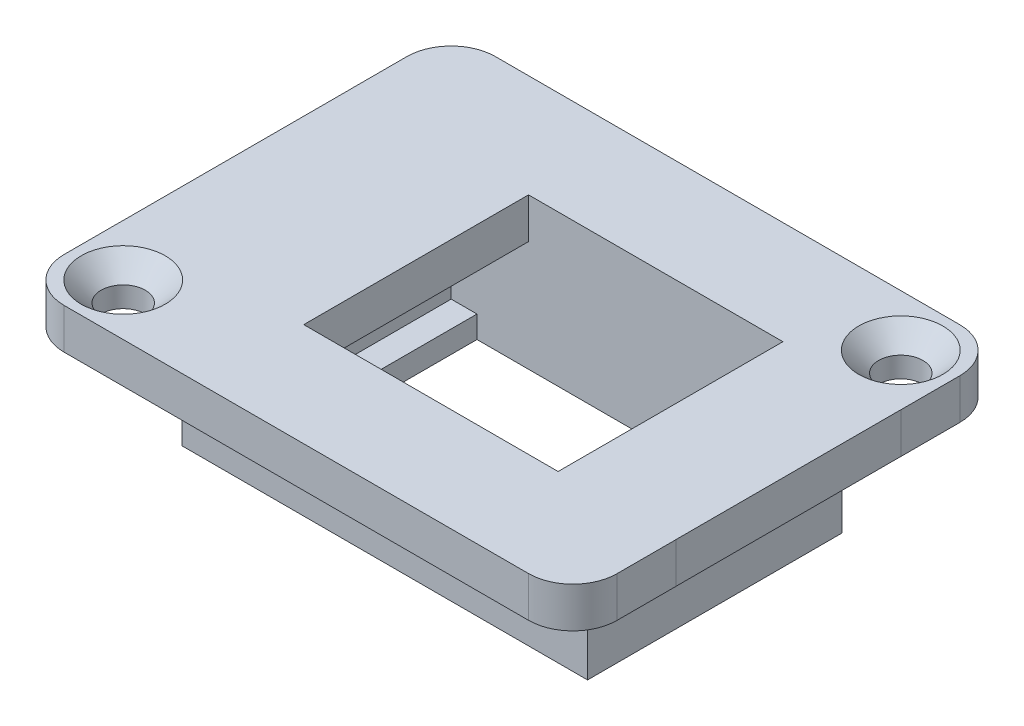
ISO-10303-21;
HEADER;
FILE_DESCRIPTION(('STEP AP214'),'2;1');
FILE_NAME('part.step','',(''),(''),'','','');
FILE_SCHEMA(('AUTOMOTIVE_DESIGN { 1 0 10303 214 1 1 1 1 }'));
ENDSEC;
DATA;
#1=APPLICATION_CONTEXT('core data for automotive mechanical design processes');
#2=APPLICATION_PROTOCOL_DEFINITION('international standard','automotive_design',2000,#1);
#3=PRODUCT_CONTEXT('',#1,'mechanical');
#4=PRODUCT('Part','Part','',(#3));
#5=PRODUCT_RELATED_PRODUCT_CATEGORY('part','',(#4));
#6=PRODUCT_DEFINITION_FORMATION('','',#4);
#7=PRODUCT_DEFINITION_CONTEXT('part definition',#1,'design');
#8=PRODUCT_DEFINITION('design','',#6,#7);
#9=PRODUCT_DEFINITION_SHAPE('','',#8);
#10=(LENGTH_UNIT() NAMED_UNIT(*) SI_UNIT(.MILLI.,.METRE.));
#11=(NAMED_UNIT(*) PLANE_ANGLE_UNIT() SI_UNIT($,.RADIAN.));
#12=(NAMED_UNIT(*) SI_UNIT($,.STERADIAN.) SOLID_ANGLE_UNIT());
#13=UNCERTAINTY_MEASURE_WITH_UNIT(LENGTH_MEASURE(1.E-05),#10,'distance_accuracy_value','');
#14=(GEOMETRIC_REPRESENTATION_CONTEXT(3) GLOBAL_UNCERTAINTY_ASSIGNED_CONTEXT((#13)) GLOBAL_UNIT_ASSIGNED_CONTEXT((#10,
#11,#12)) REPRESENTATION_CONTEXT('',''));
#15=CARTESIAN_POINT('',(0.,0.,0.));
#16=DIRECTION('',(0.,0.,1.));
#17=DIRECTION('',(1.,0.,0.));
#18=AXIS2_PLACEMENT_3D('',#15,#16,#17);
#19=CARTESIAN_POINT('',(10.753383916656,-1.9966045543594,15.25));
#20=DIRECTION('',(0.,1.,0.));
#21=DIRECTION('',(0.,0.,1.));
#22=AXIS2_PLACEMENT_3D('',#19,#20,#21);
#23=PLANE('',#22);
#24=DIRECTION('',(0.,0.,-1.));
#25=VECTOR('',#24,1.);
#26=CARTESIAN_POINT('',(-11.7499999999997,-1.99660455435946,15.25));
#27=LINE('',#26,#25);
#28=CARTESIAN_POINT('',(-11.7499999999997,-1.9966045543594,15.25));
#29=VERTEX_POINT('',#28);
#30=CARTESIAN_POINT('',(-11.7499999999997,-1.9966045543594,0.));
#31=VERTEX_POINT('',#30);
#32=EDGE_CURVE('E409',#29,#31,#27,.T.);
#33=ORIENTED_EDGE('',*,*,#32,.T.);
#34=DIRECTION('',(1.,0.,0.));
#35=VECTOR('',#34,1.);
#36=CARTESIAN_POINT('',(-13.7500000000001,-1.9966045543594,0.));
#37=LINE('',#36,#35);
#38=CARTESIAN_POINT('',(-6.50338391665595,-1.9966045543594,0.));
#39=VERTEX_POINT('',#38);
#40=EDGE_CURVE('E299',#31,#39,#37,.T.);
#41=ORIENTED_EDGE('',*,*,#40,.T.);
#42=DIRECTION('',(0.,0.,-1.));
#43=VECTOR('',#42,1.);
#44=CARTESIAN_POINT('',(-6.50338391665595,-1.9966045543594,15.25));
#45=LINE('',#44,#43);
#46=CARTESIAN_POINT('',(-6.50338391665595,-1.9966045543594,15.25));
#47=VERTEX_POINT('',#46);
#48=EDGE_CURVE('E406',#47,#39,#45,.T.);
#49=ORIENTED_EDGE('',*,*,#48,.F.);
#50=DIRECTION('',(1.,0.,0.));
#51=VECTOR('',#50,1.);
#52=CARTESIAN_POINT('',(-13.7500000000001,-1.9966045543594,15.25));
#53=LINE('',#52,#51);
#54=EDGE_CURVE('E290',#29,#47,#53,.T.);
#55=ORIENTED_EDGE('',*,*,#54,.F.);
#56=EDGE_LOOP('',(#33,#41,#49,#55));
#57=FACE_BOUND('',#56,.T.);
#58=ADVANCED_FACE('F42',(#57),#23,.F.);
#59=CARTESIAN_POINT('',(-15.2500000000001,-1.9966045543594,18.75));
#60=DIRECTION('',(0.,-1.,0.));
#61=DIRECTION('',(0.,0.,-1.));
#62=AXIS2_PLACEMENT_3D('',#59,#60,#61);
#63=CIRCLE('',#62,1.5);
#64=CARTESIAN_POINT('',(-15.2500000000001,-1.9966045543594,17.25));
#65=VERTEX_POINT('',#64);
#66=EDGE_CURVE('E318',#65,#65,#63,.T.);
#67=ORIENTED_EDGE('',*,*,#66,.F.);
#68=EDGE_LOOP('',(#67));
#69=FACE_BOUND('',#68,.T.);
#70=CARTESIAN_POINT('',(15.25,-1.9966045543594,-3.5));
#71=DIRECTION('',(0.,-1.,0.));
#72=DIRECTION('',(0.,0.,-1.));
#73=AXIS2_PLACEMENT_3D('',#70,#71,#72);
#74=CIRCLE('',#73,1.5);
#75=CARTESIAN_POINT('',(15.25,-1.9966045543594,-5.));
#76=VERTEX_POINT('',#75);
#77=EDGE_CURVE('E323',#76,#76,#74,.T.);
#78=ORIENTED_EDGE('',*,*,#77,.F.);
#79=EDGE_LOOP('',(#78));
#80=FACE_BOUND('',#79,.T.);
#81=DIRECTION('',(0.,0.,-1.));
#82=VECTOR('',#81,1.);
#83=CARTESIAN_POINT('',(18.753383916656,-1.9966045543594,22.25));
#84=LINE('',#83,#82);
#85=CARTESIAN_POINT('',(18.753383916656,-1.9966045543594,19.25));
#86=VERTEX_POINT('',#85);
#87=CARTESIAN_POINT('',(18.753383916656,-1.9966045543594,15.25));
#88=VERTEX_POINT('',#87);
#89=EDGE_CURVE('E463',#86,#88,#84,.T.);
#90=ORIENTED_EDGE('',*,*,#89,.F.);
#91=CARTESIAN_POINT('',(15.753383916656,-1.9966045543594,19.25));
#92=DIRECTION('',(0.,1.,0.));
#93=DIRECTION('',(0.,0.,1.));
#94=AXIS2_PLACEMENT_3D('',#91,#92,#93);
#95=CIRCLE('',#94,3.);
#96=CARTESIAN_POINT('',(15.753383916656,-1.9966045543594,22.25));
#97=VERTEX_POINT('',#96);
#98=EDGE_CURVE('E577',#86,#97,#95,.F.);
#99=ORIENTED_EDGE('',*,*,#98,.T.);
#100=DIRECTION('',(1.,0.,0.));
#101=VECTOR('',#100,1.);
#102=CARTESIAN_POINT('',(18.753383916656,-1.9966045543594,22.25));
#103=LINE('',#102,#101);
#104=CARTESIAN_POINT('',(-15.7533839166561,-1.9966045543594,22.25));
#105=VERTEX_POINT('',#104);
#106=EDGE_CURVE('E438',#105,#97,#103,.T.);
#107=ORIENTED_EDGE('',*,*,#106,.F.);
#108=CARTESIAN_POINT('',(-15.7533839166561,-1.9966045543594,19.25));
#109=DIRECTION('',(0.,1.,0.));
#110=DIRECTION('',(0.,0.,1.));
#111=AXIS2_PLACEMENT_3D('',#108,#109,#110);
#112=CIRCLE('',#111,3.);
#113=CARTESIAN_POINT('',(-18.7533839166561,-1.9966045543594,19.25));
#114=VERTEX_POINT('',#113);
#115=EDGE_CURVE('E574',#105,#114,#112,.F.);
#116=ORIENTED_EDGE('',*,*,#115,.T.);
#117=DIRECTION('',(0.,0.,-1.));
#118=VECTOR('',#117,1.);
#119=CARTESIAN_POINT('',(-18.7533839166561,-1.9966045543594,22.25));
#120=LINE('',#119,#118);
#121=CARTESIAN_POINT('',(-18.7533839166561,-1.9966045543594,15.25));
#122=VERTEX_POINT('',#121);
#123=EDGE_CURVE('E466',#114,#122,#120,.T.);
#124=ORIENTED_EDGE('',*,*,#123,.T.);
#125=DIRECTION('',(1.,0.,0.));
#126=VECTOR('',#125,1.);
#127=CARTESIAN_POINT('',(18.753383916656,-1.9966045543594,15.25));
#128=LINE('',#127,#126);
#129=CARTESIAN_POINT('',(-18.7500000000001,-1.9966045543594,15.25));
#130=VERTEX_POINT('',#129);
#131=EDGE_CURVE('E454',#122,#130,#128,.T.);
#132=ORIENTED_EDGE('',*,*,#131,.T.);
#133=DIRECTION('',(0.,0.,-1.));
#134=VECTOR('',#133,1.);
#135=CARTESIAN_POINT('',(-18.7500000000001,-1.9966045543594,15.25));
#136=LINE('',#135,#134);
#137=CARTESIAN_POINT('',(-18.7500000000001,-1.9966045543594,0.));
#138=VERTEX_POINT('',#137);
#139=EDGE_CURVE('E425',#130,#138,#136,.T.);
#140=ORIENTED_EDGE('',*,*,#139,.T.);
#141=DIRECTION('',(-1.,0.,0.));
#142=VECTOR('',#141,1.);
#143=CARTESIAN_POINT('',(-18.7533839166561,-1.9966045543594,0.));
#144=LINE('',#143,#142);
#145=CARTESIAN_POINT('',(-18.7533839166561,-1.9966045543594,0.));
#146=VERTEX_POINT('',#145);
#147=EDGE_CURVE('E346',#138,#146,#144,.T.);
#148=ORIENTED_EDGE('',*,*,#147,.T.);
#149=DIRECTION('',(0.,0.,1.));
#150=VECTOR('',#149,1.);
#151=CARTESIAN_POINT('',(-18.7533839166561,-1.9966045543594,-7.));
#152=LINE('',#151,#150);
#153=CARTESIAN_POINT('',(-18.7533839166561,-1.9966045543594,-4.));
#154=VERTEX_POINT('',#153);
#155=EDGE_CURVE('E356',#154,#146,#152,.T.);
#156=ORIENTED_EDGE('',*,*,#155,.F.);
#157=CARTESIAN_POINT('',(-15.7533839166561,-1.9966045543594,-4.));
#158=DIRECTION('',(0.,1.,0.));
#159=DIRECTION('',(0.,0.,1.));
#160=AXIS2_PLACEMENT_3D('',#157,#158,#159);
#161=CIRCLE('',#160,3.);
#162=CARTESIAN_POINT('',(-15.7533839166561,-1.9966045543594,-7.));
#163=VERTEX_POINT('',#162);
#164=EDGE_CURVE('E571',#154,#163,#161,.F.);
#165=ORIENTED_EDGE('',*,*,#164,.T.);
#166=DIRECTION('',(-1.,0.,0.));
#167=VECTOR('',#166,1.);
#168=CARTESIAN_POINT('',(-18.7533839166561,-1.9966045543594,-7.));
#169=LINE('',#168,#167);
#170=CARTESIAN_POINT('',(15.7533839166559,-1.9966045543594,-7.));
#171=VERTEX_POINT('',#170);
#172=EDGE_CURVE('E331',#171,#163,#169,.T.);
#173=ORIENTED_EDGE('',*,*,#172,.F.);
#174=CARTESIAN_POINT('',(15.753383916656,-1.9966045543594,-4.));
#175=DIRECTION('',(0.,1.,0.));
#176=DIRECTION('',(0.,0.,1.));
#177=AXIS2_PLACEMENT_3D('',#174,#175,#176);
#178=CIRCLE('',#177,3.);
#179=CARTESIAN_POINT('',(18.753383916656,-1.9966045543594,-4.));
#180=VERTEX_POINT('',#179);
#181=EDGE_CURVE('E568',#171,#180,#178,.F.);
#182=ORIENTED_EDGE('',*,*,#181,.T.);
#183=DIRECTION('',(0.,0.,1.));
#184=VECTOR('',#183,1.);
#185=CARTESIAN_POINT('',(18.753383916656,-1.9966045543594,-7.));
#186=LINE('',#185,#184);
#187=CARTESIAN_POINT('',(18.753383916656,-1.9966045543594,0.));
#188=VERTEX_POINT('',#187);
#189=EDGE_CURVE('E359',#180,#188,#186,.T.);
#190=ORIENTED_EDGE('',*,*,#189,.T.);
#191=CARTESIAN_POINT('',(18.75,-1.9966045543594,0.));
#192=VERTEX_POINT('',#191);
#193=EDGE_CURVE('E347',#188,#192,#144,.T.);
#194=ORIENTED_EDGE('',*,*,#193,.T.);
#195=DIRECTION('',(0.,0.,-1.));
#196=VECTOR('',#195,1.);
#197=CARTESIAN_POINT('',(18.75,-1.9966045543594,15.25));
#198=LINE('',#197,#196);
#199=CARTESIAN_POINT('',(18.75,-1.9966045543594,15.25));
#200=VERTEX_POINT('',#199);
#201=EDGE_CURVE('E529',#200,#192,#198,.T.);
#202=ORIENTED_EDGE('',*,*,#201,.F.);
#203=EDGE_CURVE('E453',#200,#88,#128,.T.);
#204=ORIENTED_EDGE('',*,*,#203,.T.);
#205=EDGE_LOOP('',(#90,#99,#107,#116,#124,#132,#140,#148,#156,#165,#173,#182,#190,#194,#202,#204));
#206=FACE_BOUND('',#205,.T.);
#207=DIRECTION('',(1.,0.,0.));
#208=VECTOR('',#207,1.);
#209=CARTESIAN_POINT('',(-13.7500000000001,-1.9966045543594,-1.));
#210=LINE('',#209,#208);
#211=CARTESIAN_POINT('',(-13.7500000000001,-1.9966045543594,-0.999999999999997));
#212=VERTEX_POINT('',#211);
#213=CARTESIAN_POINT('',(13.75,-1.9966045543594,-1.));
#214=VERTEX_POINT('',#213);
#215=EDGE_CURVE('E280',#212,#214,#210,.T.);
#216=ORIENTED_EDGE('',*,*,#215,.F.);
#217=DIRECTION('',(0.,0.,-1.));
#218=VECTOR('',#217,1.);
#219=CARTESIAN_POINT('',(-13.7500000000001,-1.9966045543594,15.25));
#220=LINE('',#219,#218);
#221=CARTESIAN_POINT('',(-13.7500000000001,-1.9966045543594,16.25));
#222=VERTEX_POINT('',#221);
#223=EDGE_CURVE('E60',#222,#212,#220,.T.);
#224=ORIENTED_EDGE('',*,*,#223,.F.);
#225=DIRECTION('',(1.,0.,0.));
#226=VECTOR('',#225,1.);
#227=CARTESIAN_POINT('',(-13.7500000000001,-1.9966045543594,16.25));
#228=LINE('',#227,#226);
#229=CARTESIAN_POINT('',(13.75,-1.9966045543594,16.25));
#230=VERTEX_POINT('',#229);
#231=EDGE_CURVE('E295',#222,#230,#228,.T.);
#232=ORIENTED_EDGE('',*,*,#231,.T.);
#233=DIRECTION('',(0.,0.,-1.));
#234=VECTOR('',#233,1.);
#235=CARTESIAN_POINT('',(13.75,-1.9966045543594,15.25));
#236=LINE('',#235,#234);
#237=EDGE_CURVE('E67',#230,#214,#236,.T.);
#238=ORIENTED_EDGE('',*,*,#237,.T.);
#239=EDGE_LOOP('',(#216,#224,#232,#238));
#240=FACE_BOUND('',#239,.T.);
#241=ADVANCED_FACE('F619',(#69,#80,#206,#240),#23,.F.);
#242=DIRECTION('',(0.,0.,-1.));
#243=VECTOR('',#242,1.);
#244=CARTESIAN_POINT('',(10.753383916656,-1.9966045543594,15.25));
#245=LINE('',#244,#243);
#246=CARTESIAN_POINT('',(10.753383916656,-1.9966045543594,15.25));
#247=VERTEX_POINT('',#246);
#248=CARTESIAN_POINT('',(10.753383916656,-1.9966045543594,0.));
#249=VERTEX_POINT('',#248);
#250=EDGE_CURVE('E517',#247,#249,#245,.T.);
#251=ORIENTED_EDGE('',*,*,#250,.T.);
#252=CARTESIAN_POINT('',(11.75,-1.9966045543594,0.));
#253=VERTEX_POINT('',#252);
#254=EDGE_CURVE('E284',#249,#253,#37,.T.);
#255=ORIENTED_EDGE('',*,*,#254,.T.);
#256=DIRECTION('',(0.,0.,-1.));
#257=VECTOR('',#256,1.);
#258=CARTESIAN_POINT('',(11.75,-1.9966045543594,15.25));
#259=LINE('',#258,#257);
#260=CARTESIAN_POINT('',(11.75,-1.9966045543594,15.25));
#261=VERTEX_POINT('',#260);
#262=EDGE_CURVE('E513',#261,#253,#259,.T.);
#263=ORIENTED_EDGE('',*,*,#262,.F.);
#264=EDGE_CURVE('E298',#247,#261,#53,.T.);
#265=ORIENTED_EDGE('',*,*,#264,.F.);
#266=EDGE_LOOP('',(#251,#255,#263,#265));
#267=FACE_BOUND('',#266,.T.);
#268=ADVANCED_FACE('F622',(#267),#23,.F.);
#269=CARTESIAN_POINT('',(0.,0.,15.25));
#270=DIRECTION('',(0.,0.,-1.));
#271=DIRECTION('',(-1.,0.,0.));
#272=AXIS2_PLACEMENT_3D('',#269,#270,#271);
#273=PLANE('',#272);
#274=DIRECTION('',(-1.,0.,0.));
#275=VECTOR('',#274,1.);
#276=CARTESIAN_POINT('',(-18.7533839166561,0.750000000000002,15.25));
#277=LINE('',#276,#275);
#278=CARTESIAN_POINT('',(-18.7500000000001,0.75,15.25));
#279=VERTEX_POINT('',#278);
#280=CARTESIAN_POINT('',(-18.7533839166561,0.750000000000002,15.25));
#281=VERTEX_POINT('',#280);
#282=EDGE_CURVE('E433',#279,#281,#277,.T.);
#283=ORIENTED_EDGE('',*,*,#282,.F.);
#284=DIRECTION('',(0.,-1.,0.));
#285=VECTOR('',#284,1.);
#286=CARTESIAN_POINT('',(-18.7500000000001,0.75,15.25));
#287=LINE('',#286,#285);
#288=EDGE_CURVE('E366',#279,#130,#287,.T.);
#289=ORIENTED_EDGE('',*,*,#288,.T.);
#290=ORIENTED_EDGE('',*,*,#131,.F.);
#291=DIRECTION('',(0.,-1.,0.));
#292=VECTOR('',#291,1.);
#293=CARTESIAN_POINT('',(-18.7533839166561,-1.9966045543594,15.25));
#294=LINE('',#293,#292);
#295=EDGE_CURVE('E448',#281,#122,#294,.T.);
#296=ORIENTED_EDGE('',*,*,#295,.F.);
#297=EDGE_LOOP('',(#283,#289,#290,#296));
#298=FACE_BOUND('',#297,.T.);
#299=ADVANCED_FACE('F630',(#298),#273,.T.);
#300=DIRECTION('',(0.,-1.,0.));
#301=VECTOR('',#300,1.);
#302=CARTESIAN_POINT('',(10.753383916656,0.75,15.25));
#303=LINE('',#302,#301);
#304=CARTESIAN_POINT('',(10.753383916656,0.75,15.25));
#305=VERTEX_POINT('',#304);
#306=EDGE_CURVE('E486',#305,#247,#303,.T.);
#307=ORIENTED_EDGE('',*,*,#306,.T.);
#308=ORIENTED_EDGE('',*,*,#264,.T.);
#309=DIRECTION('',(0.,-1.,0.));
#310=VECTOR('',#309,1.);
#311=CARTESIAN_POINT('',(11.75,-8.,15.25));
#312=LINE('',#311,#310);
#313=CARTESIAN_POINT('',(11.75,-8.,15.25));
#314=VERTEX_POINT('',#313);
#315=EDGE_CURVE('E490',#261,#314,#312,.T.);
#316=ORIENTED_EDGE('',*,*,#315,.T.);
#317=DIRECTION('',(-1.,0.,0.));
#318=VECTOR('',#317,1.);
#319=CARTESIAN_POINT('',(10.25,-8.,15.25));
#320=LINE('',#319,#318);
#321=CARTESIAN_POINT('',(10.25,-8.,15.25));
#322=VERTEX_POINT('',#321);
#323=EDGE_CURVE('E473',#314,#322,#320,.T.);
#324=ORIENTED_EDGE('',*,*,#323,.T.);
#325=DIRECTION('',(0.,-1.,0.));
#326=VECTOR('',#325,1.);
#327=CARTESIAN_POINT('',(10.25,-8.,15.25));
#328=LINE('',#327,#326);
#329=CARTESIAN_POINT('',(10.25,-9.5,15.25));
#330=VERTEX_POINT('',#329);
#331=EDGE_CURVE('E477',#322,#330,#328,.T.);
#332=ORIENTED_EDGE('',*,*,#331,.T.);
#333=DIRECTION('',(1.,0.,0.));
#334=VECTOR('',#333,1.);
#335=CARTESIAN_POINT('',(-13.7500000000001,-9.50000000000132,15.25));
#336=LINE('',#335,#334);
#337=CARTESIAN_POINT('',(-10.0000000000001,-9.50000000000132,15.25));
#338=VERTEX_POINT('',#337);
#339=EDGE_CURVE('E289',#338,#330,#336,.T.);
#340=ORIENTED_EDGE('',*,*,#339,.F.);
#341=DIRECTION('',(0.,1.,0.));
#342=VECTOR('',#341,1.);
#343=CARTESIAN_POINT('',(-10.0000000000001,-9.50000000000132,15.25));
#344=LINE('',#343,#342);
#345=CARTESIAN_POINT('',(-10.0000000000001,-8.00000000000132,15.25));
#346=VERTEX_POINT('',#345);
#347=EDGE_CURVE('E370',#338,#346,#344,.T.);
#348=ORIENTED_EDGE('',*,*,#347,.T.);
#349=DIRECTION('',(-1.,0.,0.));
#350=VECTOR('',#349,1.);
#351=CARTESIAN_POINT('',(-11.7499999999997,-8.00000000000132,15.25));
#352=LINE('',#351,#350);
#353=CARTESIAN_POINT('',(-11.7499999999997,-8.00000000000132,15.25));
#354=VERTEX_POINT('',#353);
#355=EDGE_CURVE('E375',#346,#354,#352,.T.);
#356=ORIENTED_EDGE('',*,*,#355,.T.);
#357=DIRECTION('',(0.,1.,0.));
#358=VECTOR('',#357,1.);
#359=CARTESIAN_POINT('',(-11.7499999999997,-8.00000000000132,15.25));
#360=LINE('',#359,#358);
#361=EDGE_CURVE('E379',#354,#29,#360,.T.);
#362=ORIENTED_EDGE('',*,*,#361,.T.);
#363=ORIENTED_EDGE('',*,*,#54,.T.);
#364=DIRECTION('',(0.,1.,0.));
#365=VECTOR('',#364,1.);
#366=CARTESIAN_POINT('',(-6.50338391665595,0.75,15.25));
#367=LINE('',#366,#365);
#368=CARTESIAN_POINT('',(-6.50338391665595,0.750000000000002,15.25));
#369=VERTEX_POINT('',#368);
#370=EDGE_CURVE('E383',#47,#369,#367,.T.);
#371=ORIENTED_EDGE('',*,*,#370,.T.);
#372=EDGE_CURVE('E449',#305,#369,#277,.T.);
#373=ORIENTED_EDGE('',*,*,#372,.F.);
#374=EDGE_LOOP('',(#307,#308,#316,#324,#332,#340,#348,#356,#362,#363,#371,#373));
#375=FACE_BOUND('',#374,.T.);
#376=ADVANCED_FACE('F636',(#375),#273,.T.);
#377=CARTESIAN_POINT('',(10.25,-8.,15.25));
#378=DIRECTION('',(0.,-1.,0.));
#379=DIRECTION('',(1.,0.,0.));
#380=AXIS2_PLACEMENT_3D('',#377,#378,#379);
#381=PLANE('',#380);
#382=DIRECTION('',(-1.,0.,0.));
#383=VECTOR('',#382,1.);
#384=CARTESIAN_POINT('',(10.25,-8.,0.));
#385=LINE('',#384,#383);
#386=CARTESIAN_POINT('',(11.75,-8.,0.));
#387=VERTEX_POINT('',#386);
#388=CARTESIAN_POINT('',(10.25,-8.,0.));
#389=VERTEX_POINT('',#388);
#390=EDGE_CURVE('E472',#387,#389,#385,.T.);
#391=ORIENTED_EDGE('',*,*,#390,.T.);
#392=DIRECTION('',(0.,0.,-1.));
#393=VECTOR('',#392,1.);
#394=CARTESIAN_POINT('',(10.25,-8.,15.25));
#395=LINE('',#394,#393);
#396=EDGE_CURVE('E542',#322,#389,#395,.T.);
#397=ORIENTED_EDGE('',*,*,#396,.F.);
#398=ORIENTED_EDGE('',*,*,#323,.F.);
#399=DIRECTION('',(0.,0.,-1.));
#400=VECTOR('',#399,1.);
#401=CARTESIAN_POINT('',(11.75,-8.,15.25));
#402=LINE('',#401,#400);
#403=EDGE_CURVE('E494',#314,#387,#402,.T.);
#404=ORIENTED_EDGE('',*,*,#403,.T.);
#405=EDGE_LOOP('',(#391,#397,#398,#404));
#406=FACE_BOUND('',#405,.T.);
#407=ADVANCED_FACE('F675',(#406),#381,.F.);
#408=CARTESIAN_POINT('',(10.25,-8.,15.25));
#409=DIRECTION('',(1.,0.,0.));
#410=DIRECTION('',(0.,0.,-1.));
#411=AXIS2_PLACEMENT_3D('',#408,#409,#410);
#412=PLANE('',#411);
#413=DIRECTION('',(0.,-1.,0.));
#414=VECTOR('',#413,1.);
#415=CARTESIAN_POINT('',(10.25,-8.,0.));
#416=LINE('',#415,#414);
#417=CARTESIAN_POINT('',(10.25,-9.5,0.));
#418=VERTEX_POINT('',#417);
#419=EDGE_CURVE('E498',#389,#418,#416,.T.);
#420=ORIENTED_EDGE('',*,*,#419,.T.);
#421=DIRECTION('',(0.,0.,-1.));
#422=VECTOR('',#421,1.);
#423=CARTESIAN_POINT('',(10.25,-9.5,15.25));
#424=LINE('',#423,#422);
#425=EDGE_CURVE('E538',#330,#418,#424,.T.);
#426=ORIENTED_EDGE('',*,*,#425,.F.);
#427=ORIENTED_EDGE('',*,*,#331,.F.);
#428=ORIENTED_EDGE('',*,*,#396,.T.);
#429=EDGE_LOOP('',(#420,#426,#427,#428));
#430=FACE_BOUND('',#429,.T.);
#431=ADVANCED_FACE('F668',(#430),#412,.F.);
#432=CARTESIAN_POINT('',(10.25,-9.5,15.25));
#433=DIRECTION('',(0.,1.,0.));
#434=DIRECTION('',(0.,0.,1.));
#435=AXIS2_PLACEMENT_3D('',#432,#433,#434);
#436=PLANE('',#435);
#437=DIRECTION('',(1.,0.,0.));
#438=VECTOR('',#437,1.);
#439=CARTESIAN_POINT('',(-13.7500000000001,-9.50000000000132,0.));
#440=LINE('',#439,#438);
#441=CARTESIAN_POINT('',(-10.0000000000001,-9.50000000000132,0.));
#442=VERTEX_POINT('',#441);
#443=EDGE_CURVE('E275',#442,#418,#440,.T.);
#444=ORIENTED_EDGE('',*,*,#443,.F.);
#445=DIRECTION('',(0.,0.,-1.));
#446=VECTOR('',#445,1.);
#447=CARTESIAN_POINT('',(-10.0000000000001,-9.50000000000132,15.25));
#448=LINE('',#447,#446);
#449=EDGE_CURVE('E263',#338,#442,#448,.T.);
#450=ORIENTED_EDGE('',*,*,#449,.F.);
#451=ORIENTED_EDGE('',*,*,#339,.T.);
#452=ORIENTED_EDGE('',*,*,#425,.T.);
#453=EDGE_LOOP('',(#444,#450,#451,#452));
#454=FACE_BOUND('',#453,.T.);
#455=DIRECTION('',(0.,0.,-1.));
#456=VECTOR('',#455,1.);
#457=CARTESIAN_POINT('',(-13.7500000000001,-9.50000000000132,15.25));
#458=LINE('',#457,#456);
#459=CARTESIAN_POINT('',(-13.7500000000001,-9.50000000000132,16.25));
#460=VERTEX_POINT('',#459);
#461=CARTESIAN_POINT('',(-13.7500000000001,-9.50000000000132,-1.));
#462=VERTEX_POINT('',#461);
#463=EDGE_CURVE('E254',#460,#462,#458,.T.);
#464=ORIENTED_EDGE('',*,*,#463,.T.);
#465=DIRECTION('',(1.,0.,0.));
#466=VECTOR('',#465,1.);
#467=CARTESIAN_POINT('',(-13.7500000000001,-9.50000000000132,-1.));
#468=LINE('',#467,#466);
#469=CARTESIAN_POINT('',(13.75,-9.50000000000132,-1.));
#470=VERTEX_POINT('',#469);
#471=EDGE_CURVE('E257',#462,#470,#468,.T.);
#472=ORIENTED_EDGE('',*,*,#471,.T.);
#473=DIRECTION('',(0.,0.,-1.));
#474=VECTOR('',#473,1.);
#475=CARTESIAN_POINT('',(13.75,-9.5,15.25));
#476=LINE('',#475,#474);
#477=CARTESIAN_POINT('',(13.75,-9.50000000000132,16.25));
#478=VERTEX_POINT('',#477);
#479=EDGE_CURVE('E535',#478,#470,#476,.T.);
#480=ORIENTED_EDGE('',*,*,#479,.F.);
#481=DIRECTION('',(1.,0.,0.));
#482=VECTOR('',#481,1.);
#483=CARTESIAN_POINT('',(-13.7500000000001,-9.50000000000132,16.25));
#484=LINE('',#483,#482);
#485=EDGE_CURVE('E260',#460,#478,#484,.T.);
#486=ORIENTED_EDGE('',*,*,#485,.F.);
#487=EDGE_LOOP('',(#464,#472,#480,#486));
#488=FACE_BOUND('',#487,.T.);
#489=ADVANCED_FACE('F255',(#454,#488),#436,.F.);
#490=CARTESIAN_POINT('',(13.75,-1.9966045543594,15.25));
#491=DIRECTION('',(-1.,0.,0.));
#492=DIRECTION('',(0.,0.,1.));
#493=AXIS2_PLACEMENT_3D('',#490,#491,#492);
#494=PLANE('',#493);
#495=ORIENTED_EDGE('',*,*,#479,.T.);
#496=DIRECTION('',(0.,1.,0.));
#497=VECTOR('',#496,1.);
#498=CARTESIAN_POINT('',(13.75,-9.50000000000132,-1.));
#499=LINE('',#498,#497);
#500=EDGE_CURVE('E271',#470,#214,#499,.T.);
#501=ORIENTED_EDGE('',*,*,#500,.T.);
#502=ORIENTED_EDGE('',*,*,#237,.F.);
#503=DIRECTION('',(0.,1.,0.));
#504=VECTOR('',#503,1.);
#505=CARTESIAN_POINT('',(13.75,-9.50000000000132,16.25));
#506=LINE('',#505,#504);
#507=EDGE_CURVE('E303',#478,#230,#506,.T.);
#508=ORIENTED_EDGE('',*,*,#507,.F.);
#509=EDGE_LOOP('',(#495,#501,#502,#508));
#510=FACE_BOUND('',#509,.T.);
#511=ADVANCED_FACE('F656',(#510),#494,.F.);
#512=CARTESIAN_POINT('',(18.75,0.75,15.25));
#513=DIRECTION('',(-1.,0.,0.));
#514=DIRECTION('',(0.,0.,1.));
#515=AXIS2_PLACEMENT_3D('',#512,#513,#514);
#516=PLANE('',#515);
#517=DIRECTION('',(0.,1.,0.));
#518=VECTOR('',#517,1.);
#519=CARTESIAN_POINT('',(18.75,0.75,0.));
#520=LINE('',#519,#518);
#521=CARTESIAN_POINT('',(18.75,0.75,0.));
#522=VERTEX_POINT('',#521);
#523=EDGE_CURVE('E501',#192,#522,#520,.T.);
#524=ORIENTED_EDGE('',*,*,#523,.T.);
#525=DIRECTION('',(0.,0.,-1.));
#526=VECTOR('',#525,1.);
#527=CARTESIAN_POINT('',(18.75,0.75,15.25));
#528=LINE('',#527,#526);
#529=CARTESIAN_POINT('',(18.75,0.75,15.25));
#530=VERTEX_POINT('',#529);
#531=EDGE_CURVE('E525',#530,#522,#528,.T.);
#532=ORIENTED_EDGE('',*,*,#531,.F.);
#533=DIRECTION('',(0.,1.,0.));
#534=VECTOR('',#533,1.);
#535=CARTESIAN_POINT('',(18.75,0.75,15.25));
#536=LINE('',#535,#534);
#537=EDGE_CURVE('E482',#200,#530,#536,.T.);
#538=ORIENTED_EDGE('',*,*,#537,.F.);
#539=ORIENTED_EDGE('',*,*,#201,.T.);
#540=EDGE_LOOP('',(#524,#532,#538,#539));
#541=FACE_BOUND('',#540,.T.);
#542=ADVANCED_FACE('F658',(#541),#516,.F.);
#543=CARTESIAN_POINT('',(10.753383916656,0.75,15.25));
#544=DIRECTION('',(0.,-1.,0.));
#545=DIRECTION('',(0.,0.,-1.));
#546=AXIS2_PLACEMENT_3D('',#543,#544,#545);
#547=PLANE('',#546);
#548=CARTESIAN_POINT('',(-15.2500000000001,0.75,18.75));
#549=DIRECTION('',(0.,1.,0.));
#550=DIRECTION('',(0.,0.,1.));
#551=AXIS2_PLACEMENT_3D('',#548,#549,#550);
#552=CIRCLE('',#551,2.85);
#553=CARTESIAN_POINT('',(-15.2500000000001,0.75,21.6));
#554=VERTEX_POINT('',#553);
#555=EDGE_CURVE('E310',#554,#554,#552,.T.);
#556=ORIENTED_EDGE('',*,*,#555,.F.);
#557=EDGE_LOOP('',(#556));
#558=FACE_BOUND('',#557,.T.);
#559=CARTESIAN_POINT('',(15.25,0.75,-3.5));
#560=DIRECTION('',(0.,1.,0.));
#561=DIRECTION('',(0.,0.,1.));
#562=AXIS2_PLACEMENT_3D('',#559,#560,#561);
#563=CIRCLE('',#562,2.85);
#564=CARTESIAN_POINT('',(15.25,0.75,-0.649999999999997));
#565=VERTEX_POINT('',#564);
#566=EDGE_CURVE('E307',#565,#565,#563,.T.);
#567=ORIENTED_EDGE('',*,*,#566,.F.);
#568=EDGE_LOOP('',(#567));
#569=FACE_BOUND('',#568,.T.);
#570=DIRECTION('',(1.,0.,0.));
#571=VECTOR('',#570,1.);
#572=CARTESIAN_POINT('',(18.753383916656,0.75,0.));
#573=LINE('',#572,#571);
#574=CARTESIAN_POINT('',(-6.50338391665595,0.75,0.));
#575=VERTEX_POINT('',#574);
#576=CARTESIAN_POINT('',(10.753383916656,0.75,0.));
#577=VERTEX_POINT('',#576);
#578=EDGE_CURVE('E342',#575,#577,#573,.T.);
#579=ORIENTED_EDGE('',*,*,#578,.T.);
#580=DIRECTION('',(0.,0.,-1.));
#581=VECTOR('',#580,1.);
#582=CARTESIAN_POINT('',(10.753383916656,0.75,15.25));
#583=LINE('',#582,#581);
#584=EDGE_CURVE('E521',#305,#577,#583,.T.);
#585=ORIENTED_EDGE('',*,*,#584,.F.);
#586=ORIENTED_EDGE('',*,*,#372,.T.);
#587=DIRECTION('',(0.,0.,-1.));
#588=VECTOR('',#587,1.);
#589=CARTESIAN_POINT('',(-6.50338391665595,0.75,15.25));
#590=LINE('',#589,#588);
#591=EDGE_CURVE('E387',#369,#575,#590,.T.);
#592=ORIENTED_EDGE('',*,*,#591,.T.);
#593=EDGE_LOOP('',(#579,#585,#586,#592));
#594=FACE_BOUND('',#593,.T.);
#595=DIRECTION('',(-1.,0.,0.));
#596=VECTOR('',#595,1.);
#597=CARTESIAN_POINT('',(-18.7533839166561,0.750000000000002,22.25));
#598=LINE('',#597,#596);
#599=CARTESIAN_POINT('',(15.7533839166559,0.750000000000002,22.25));
#600=VERTEX_POINT('',#599);
#601=CARTESIAN_POINT('',(-15.7533839166561,0.750000000000002,22.25));
#602=VERTEX_POINT('',#601);
#603=EDGE_CURVE('E434',#600,#602,#598,.T.);
#604=ORIENTED_EDGE('',*,*,#603,.F.);
#605=CARTESIAN_POINT('',(15.753383916656,0.75,19.25));
#606=DIRECTION('',(0.,-1.,0.));
#607=DIRECTION('',(0.,0.,-1.));
#608=AXIS2_PLACEMENT_3D('',#605,#606,#607);
#609=CIRCLE('',#608,3.);
#610=CARTESIAN_POINT('',(18.753383916656,0.750000000000002,19.25));
#611=VERTEX_POINT('',#610);
#612=EDGE_CURVE('E562',#600,#611,#609,.F.);
#613=ORIENTED_EDGE('',*,*,#612,.T.);
#614=DIRECTION('',(0.,0.,-1.));
#615=VECTOR('',#614,1.);
#616=CARTESIAN_POINT('',(18.753383916656,0.750000000000002,22.25));
#617=LINE('',#616,#615);
#618=CARTESIAN_POINT('',(18.753383916656,0.750000000000002,15.25));
#619=VERTEX_POINT('',#618);
#620=EDGE_CURVE('E443',#611,#619,#617,.T.);
#621=ORIENTED_EDGE('',*,*,#620,.T.);
#622=EDGE_CURVE('E444',#619,#530,#277,.T.);
#623=ORIENTED_EDGE('',*,*,#622,.T.);
#624=ORIENTED_EDGE('',*,*,#531,.T.);
#625=CARTESIAN_POINT('',(18.753383916656,0.75,0.));
#626=VERTEX_POINT('',#625);
#627=EDGE_CURVE('E322',#522,#626,#573,.T.);
#628=ORIENTED_EDGE('',*,*,#627,.T.);
#629=DIRECTION('',(0.,0.,1.));
#630=VECTOR('',#629,1.);
#631=CARTESIAN_POINT('',(18.753383916656,0.75,-7.));
#632=LINE('',#631,#630);
#633=CARTESIAN_POINT('',(18.753383916656,0.75,-4.));
#634=VERTEX_POINT('',#633);
#635=EDGE_CURVE('E362',#634,#626,#632,.T.);
#636=ORIENTED_EDGE('',*,*,#635,.F.);
#637=CARTESIAN_POINT('',(15.753383916656,0.75,-4.));
#638=DIRECTION('',(0.,-1.,0.));
#639=DIRECTION('',(0.,0.,-1.));
#640=AXIS2_PLACEMENT_3D('',#637,#638,#639);
#641=CIRCLE('',#640,3.);
#642=CARTESIAN_POINT('',(15.753383916656,0.75,-7.));
#643=VERTEX_POINT('',#642);
#644=EDGE_CURVE('E553',#634,#643,#641,.F.);
#645=ORIENTED_EDGE('',*,*,#644,.T.);
#646=DIRECTION('',(1.,0.,0.));
#647=VECTOR('',#646,1.);
#648=CARTESIAN_POINT('',(18.753383916656,0.75,-7.));
#649=LINE('',#648,#647);
#650=CARTESIAN_POINT('',(-15.7533839166561,0.75,-7.));
#651=VERTEX_POINT('',#650);
#652=EDGE_CURVE('E327',#651,#643,#649,.T.);
#653=ORIENTED_EDGE('',*,*,#652,.F.);
#654=CARTESIAN_POINT('',(-15.7533839166561,0.75,-4.));
#655=DIRECTION('',(0.,-1.,0.));
#656=DIRECTION('',(0.,0.,-1.));
#657=AXIS2_PLACEMENT_3D('',#654,#655,#656);
#658=CIRCLE('',#657,3.);
#659=CARTESIAN_POINT('',(-18.7533839166561,0.75,-4.));
#660=VERTEX_POINT('',#659);
#661=EDGE_CURVE('E556',#651,#660,#658,.F.);
#662=ORIENTED_EDGE('',*,*,#661,.T.);
#663=DIRECTION('',(0.,0.,1.));
#664=VECTOR('',#663,1.);
#665=CARTESIAN_POINT('',(-18.7533839166561,0.75,-7.));
#666=LINE('',#665,#664);
#667=CARTESIAN_POINT('',(-18.7533839166561,0.75,0.));
#668=VERTEX_POINT('',#667);
#669=EDGE_CURVE('E336',#660,#668,#666,.T.);
#670=ORIENTED_EDGE('',*,*,#669,.T.);
#671=CARTESIAN_POINT('',(-18.7500000000001,0.75,0.));
#672=VERTEX_POINT('',#671);
#673=EDGE_CURVE('E337',#668,#672,#573,.T.);
#674=ORIENTED_EDGE('',*,*,#673,.T.);
#675=DIRECTION('',(0.,0.,-1.));
#676=VECTOR('',#675,1.);
#677=CARTESIAN_POINT('',(-18.7500000000001,0.75,15.25));
#678=LINE('',#677,#676);
#679=EDGE_CURVE('E429',#279,#672,#678,.T.);
#680=ORIENTED_EDGE('',*,*,#679,.F.);
#681=ORIENTED_EDGE('',*,*,#282,.T.);
#682=DIRECTION('',(0.,0.,-1.));
#683=VECTOR('',#682,1.);
#684=CARTESIAN_POINT('',(-18.7533839166561,0.750000000000002,22.25));
#685=LINE('',#684,#683);
#686=CARTESIAN_POINT('',(-18.7533839166561,0.750000000000002,19.25));
#687=VERTEX_POINT('',#686);
#688=EDGE_CURVE('E469',#687,#281,#685,.T.);
#689=ORIENTED_EDGE('',*,*,#688,.F.);
#690=CARTESIAN_POINT('',(-15.7533839166561,0.75,19.25));
#691=DIRECTION('',(0.,-1.,0.));
#692=DIRECTION('',(0.,0.,-1.));
#693=AXIS2_PLACEMENT_3D('',#690,#691,#692);
#694=CIRCLE('',#693,3.);
#695=EDGE_CURVE('E559',#687,#602,#694,.F.);
#696=ORIENTED_EDGE('',*,*,#695,.T.);
#697=EDGE_LOOP('',(#604,#613,#621,#623,#624,#628,#636,#645,#653,#662,#670,#674,#680,#681,#689,#696));
#698=FACE_BOUND('',#697,.T.);
#699=ADVANCED_FACE('F665',(#558,#569,#594,#698),#547,.F.);
#700=CARTESIAN_POINT('',(10.753383916656,0.75,15.25));
#701=DIRECTION('',(1.,0.,0.));
#702=DIRECTION('',(0.,0.,-1.));
#703=AXIS2_PLACEMENT_3D('',#700,#701,#702);
#704=PLANE('',#703);
#705=DIRECTION('',(0.,-1.,0.));
#706=VECTOR('',#705,1.);
#707=CARTESIAN_POINT('',(10.753383916656,0.75,0.));
#708=LINE('',#707,#706);
#709=EDGE_CURVE('E505',#577,#249,#708,.T.);
#710=ORIENTED_EDGE('',*,*,#709,.T.);
#711=ORIENTED_EDGE('',*,*,#250,.F.);
#712=ORIENTED_EDGE('',*,*,#306,.F.);
#713=ORIENTED_EDGE('',*,*,#584,.T.);
#714=EDGE_LOOP('',(#710,#711,#712,#713));
#715=FACE_BOUND('',#714,.T.);
#716=ADVANCED_FACE('F777',(#715),#704,.F.);
#717=CARTESIAN_POINT('',(11.75,-8.,15.25));
#718=DIRECTION('',(1.,0.,0.));
#719=DIRECTION('',(0.,0.,-1.));
#720=AXIS2_PLACEMENT_3D('',#717,#718,#719);
#721=PLANE('',#720);
#722=DIRECTION('',(0.,-1.,0.));
#723=VECTOR('',#722,1.);
#724=CARTESIAN_POINT('',(11.75,-8.,0.));
#725=LINE('',#724,#723);
#726=EDGE_CURVE('E478',#253,#387,#725,.T.);
#727=ORIENTED_EDGE('',*,*,#726,.T.);
#728=ORIENTED_EDGE('',*,*,#403,.F.);
#729=ORIENTED_EDGE('',*,*,#315,.F.);
#730=ORIENTED_EDGE('',*,*,#262,.T.);
#731=EDGE_LOOP('',(#727,#728,#729,#730));
#732=FACE_BOUND('',#731,.T.);
#733=ADVANCED_FACE('F775',(#732),#721,.F.);
#734=ORIENTED_EDGE('',*,*,#203,.F.);
#735=ORIENTED_EDGE('',*,*,#537,.T.);
#736=ORIENTED_EDGE('',*,*,#622,.F.);
#737=DIRECTION('',(0.,1.,0.));
#738=VECTOR('',#737,1.);
#739=CARTESIAN_POINT('',(18.753383916656,0.750000000000002,15.25));
#740=LINE('',#739,#738);
#741=EDGE_CURVE('E439',#88,#619,#740,.T.);
#742=ORIENTED_EDGE('',*,*,#741,.F.);
#743=EDGE_LOOP('',(#734,#735,#736,#742));
#744=FACE_BOUND('',#743,.T.);
#745=ADVANCED_FACE('F639',(#744),#273,.T.);
#746=CARTESIAN_POINT('',(-18.7533839166561,-1.9966045543594,22.25));
#747=DIRECTION('',(1.,0.,0.));
#748=DIRECTION('',(0.,0.,-1.));
#749=AXIS2_PLACEMENT_3D('',#746,#747,#748);
#750=PLANE('',#749);
#751=ORIENTED_EDGE('',*,*,#123,.F.);
#752=DIRECTION('',(0.,-1.,0.));
#753=VECTOR('',#752,1.);
#754=CARTESIAN_POINT('',(-18.7533839166561,-1.9966045543594,19.25));
#755=LINE('',#754,#753);
#756=EDGE_CURVE('E580',#114,#687,#755,.F.);
#757=ORIENTED_EDGE('',*,*,#756,.T.);
#758=ORIENTED_EDGE('',*,*,#688,.T.);
#759=ORIENTED_EDGE('',*,*,#295,.T.);
#760=EDGE_LOOP('',(#751,#757,#758,#759));
#761=FACE_BOUND('',#760,.T.);
#762=ADVANCED_FACE('F756',(#761),#750,.F.);
#763=CARTESIAN_POINT('',(18.753383916656,0.750000000000002,22.25));
#764=DIRECTION('',(-1.,0.,0.));
#765=DIRECTION('',(0.,0.,1.));
#766=AXIS2_PLACEMENT_3D('',#763,#764,#765);
#767=PLANE('',#766);
#768=ORIENTED_EDGE('',*,*,#620,.F.);
#769=DIRECTION('',(0.,1.,0.));
#770=VECTOR('',#769,1.);
#771=CARTESIAN_POINT('',(18.753383916656,0.750000000000002,19.25));
#772=LINE('',#771,#770);
#773=EDGE_CURVE('E565',#611,#86,#772,.F.);
#774=ORIENTED_EDGE('',*,*,#773,.T.);
#775=ORIENTED_EDGE('',*,*,#89,.T.);
#776=ORIENTED_EDGE('',*,*,#741,.T.);
#777=EDGE_LOOP('',(#768,#774,#775,#776));
#778=FACE_BOUND('',#777,.T.);
#779=ADVANCED_FACE('F729',(#778),#767,.F.);
#780=CARTESIAN_POINT('',(0.,0.,22.25));
#781=DIRECTION('',(0.,0.,-1.));
#782=DIRECTION('',(-1.,0.,0.));
#783=AXIS2_PLACEMENT_3D('',#780,#781,#782);
#784=PLANE('',#783);
#785=ORIENTED_EDGE('',*,*,#106,.T.);
#786=DIRECTION('',(0.,1.,0.));
#787=VECTOR('',#786,1.);
#788=CARTESIAN_POINT('',(15.753383916656,0.,22.25));
#789=LINE('',#788,#787);
#790=EDGE_CURVE('E549',#97,#600,#789,.T.);
#791=ORIENTED_EDGE('',*,*,#790,.T.);
#792=ORIENTED_EDGE('',*,*,#603,.T.);
#793=DIRECTION('',(0.,-1.,0.));
#794=VECTOR('',#793,1.);
#795=CARTESIAN_POINT('',(-15.7533839166561,0.,22.25));
#796=LINE('',#795,#794);
#797=EDGE_CURVE('E545',#602,#105,#796,.T.);
#798=ORIENTED_EDGE('',*,*,#797,.T.);
#799=EDGE_LOOP('',(#785,#791,#792,#798));
#800=FACE_BOUND('',#799,.T.);
#801=ADVANCED_FACE('F761',(#800),#784,.F.);
#802=CARTESIAN_POINT('',(-18.7500000000001,0.75,15.25));
#803=DIRECTION('',(1.,0.,0.));
#804=DIRECTION('',(0.,0.,-1.));
#805=AXIS2_PLACEMENT_3D('',#802,#803,#804);
#806=PLANE('',#805);
#807=DIRECTION('',(0.,-1.,0.));
#808=VECTOR('',#807,1.);
#809=CARTESIAN_POINT('',(-18.7500000000001,0.75,0.));
#810=LINE('',#809,#808);
#811=EDGE_CURVE('E365',#672,#138,#810,.T.);
#812=ORIENTED_EDGE('',*,*,#811,.T.);
#813=ORIENTED_EDGE('',*,*,#139,.F.);
#814=ORIENTED_EDGE('',*,*,#288,.F.);
#815=ORIENTED_EDGE('',*,*,#679,.T.);
#816=EDGE_LOOP('',(#812,#813,#814,#815));
#817=FACE_BOUND('',#816,.T.);
#818=ADVANCED_FACE('F749',(#817),#806,.F.);
#819=CARTESIAN_POINT('',(-13.7500000000001,-1.9966045543594,15.25));
#820=DIRECTION('',(1.,0.,0.));
#821=DIRECTION('',(0.,0.,-1.));
#822=AXIS2_PLACEMENT_3D('',#819,#820,#821);
#823=PLANE('',#822);
#824=ORIENTED_EDGE('',*,*,#223,.T.);
#825=DIRECTION('',(0.,1.,0.));
#826=VECTOR('',#825,1.);
#827=CARTESIAN_POINT('',(-13.7500000000001,-9.50000000000132,-1.));
#828=LINE('',#827,#826);
#829=EDGE_CURVE('E266',#462,#212,#828,.T.);
#830=ORIENTED_EDGE('',*,*,#829,.F.);
#831=ORIENTED_EDGE('',*,*,#463,.F.);
#832=DIRECTION('',(0.,1.,0.));
#833=VECTOR('',#832,1.);
#834=CARTESIAN_POINT('',(-13.7500000000001,-9.50000000000132,16.25));
#835=LINE('',#834,#833);
#836=EDGE_CURVE('E294',#460,#222,#835,.T.);
#837=ORIENTED_EDGE('',*,*,#836,.T.);
#838=EDGE_LOOP('',(#824,#830,#831,#837));
#839=FACE_BOUND('',#838,.T.);
#840=ADVANCED_FACE('F267',(#839),#823,.F.);
#841=CARTESIAN_POINT('',(-10.0000000000001,-9.50000000000132,15.25));
#842=DIRECTION('',(-1.,0.,0.));
#843=DIRECTION('',(0.,0.,1.));
#844=AXIS2_PLACEMENT_3D('',#841,#842,#843);
#845=PLANE('',#844);
#846=DIRECTION('',(0.,1.,0.));
#847=VECTOR('',#846,1.);
#848=CARTESIAN_POINT('',(-10.0000000000001,-9.50000000000132,0.));
#849=LINE('',#848,#847);
#850=CARTESIAN_POINT('',(-10.0000000000001,-8.00000000000132,0.));
#851=VERTEX_POINT('',#850);
#852=EDGE_CURVE('E391',#442,#851,#849,.T.);
#853=ORIENTED_EDGE('',*,*,#852,.T.);
#854=DIRECTION('',(0.,0.,-1.));
#855=VECTOR('',#854,1.);
#856=CARTESIAN_POINT('',(-10.0000000000001,-8.00000000000132,15.25));
#857=LINE('',#856,#855);
#858=EDGE_CURVE('E417',#346,#851,#857,.T.);
#859=ORIENTED_EDGE('',*,*,#858,.F.);
#860=ORIENTED_EDGE('',*,*,#347,.F.);
#861=ORIENTED_EDGE('',*,*,#449,.T.);
#862=EDGE_LOOP('',(#853,#859,#860,#861));
#863=FACE_BOUND('',#862,.T.);
#864=ADVANCED_FACE('F810',(#863),#845,.F.);
#865=CARTESIAN_POINT('',(-11.7499999999997,-8.00000000000132,15.25));
#866=DIRECTION('',(0.,-1.,0.));
#867=DIRECTION('',(0.,0.,-1.));
#868=AXIS2_PLACEMENT_3D('',#865,#866,#867);
#869=PLANE('',#868);
#870=DIRECTION('',(-1.,0.,0.));
#871=VECTOR('',#870,1.);
#872=CARTESIAN_POINT('',(-11.7499999999997,-8.00000000000132,0.));
#873=LINE('',#872,#871);
#874=CARTESIAN_POINT('',(-11.7499999999997,-8.00000000000132,0.));
#875=VERTEX_POINT('',#874);
#876=EDGE_CURVE('E394',#851,#875,#873,.T.);
#877=ORIENTED_EDGE('',*,*,#876,.T.);
#878=DIRECTION('',(0.,0.,-1.));
#879=VECTOR('',#878,1.);
#880=CARTESIAN_POINT('',(-11.7499999999997,-8.00000000000132,15.25));
#881=LINE('',#880,#879);
#882=EDGE_CURVE('E413',#354,#875,#881,.T.);
#883=ORIENTED_EDGE('',*,*,#882,.F.);
#884=ORIENTED_EDGE('',*,*,#355,.F.);
#885=ORIENTED_EDGE('',*,*,#858,.T.);
#886=EDGE_LOOP('',(#877,#883,#884,#885));
#887=FACE_BOUND('',#886,.T.);
#888=ADVANCED_FACE('F808',(#887),#869,.F.);
#889=CARTESIAN_POINT('',(-11.7499999999997,-8.00000000000132,15.25));
#890=DIRECTION('',(-1.,0.,0.));
#891=DIRECTION('',(0.,-1.,0.));
#892=AXIS2_PLACEMENT_3D('',#889,#890,#891);
#893=PLANE('',#892);
#894=DIRECTION('',(0.,1.,0.));
#895=VECTOR('',#894,1.);
#896=CARTESIAN_POINT('',(-11.7499999999997,-8.00000000000132,0.));
#897=LINE('',#896,#895);
#898=EDGE_CURVE('E397',#875,#31,#897,.T.);
#899=ORIENTED_EDGE('',*,*,#898,.T.);
#900=ORIENTED_EDGE('',*,*,#32,.F.);
#901=ORIENTED_EDGE('',*,*,#361,.F.);
#902=ORIENTED_EDGE('',*,*,#882,.T.);
#903=EDGE_LOOP('',(#899,#900,#901,#902));
#904=FACE_BOUND('',#903,.T.);
#905=ADVANCED_FACE('F804',(#904),#893,.F.);
#906=CARTESIAN_POINT('',(-6.50338391665595,0.75,15.25));
#907=DIRECTION('',(-1.,0.,0.));
#908=DIRECTION('',(0.,0.,1.));
#909=AXIS2_PLACEMENT_3D('',#906,#907,#908);
#910=PLANE('',#909);
#911=DIRECTION('',(0.,1.,0.));
#912=VECTOR('',#911,1.);
#913=CARTESIAN_POINT('',(-6.50338391665595,0.75,0.));
#914=LINE('',#913,#912);
#915=EDGE_CURVE('E371',#39,#575,#914,.T.);
#916=ORIENTED_EDGE('',*,*,#915,.T.);
#917=ORIENTED_EDGE('',*,*,#591,.F.);
#918=ORIENTED_EDGE('',*,*,#370,.F.);
#919=ORIENTED_EDGE('',*,*,#48,.T.);
#920=EDGE_LOOP('',(#916,#917,#918,#919));
#921=FACE_BOUND('',#920,.T.);
#922=ADVANCED_FACE('F797',(#921),#910,.F.);
#923=CARTESIAN_POINT('',(0.,0.,0.));
#924=DIRECTION('',(0.,0.,1.));
#925=DIRECTION('',(1.,0.,0.));
#926=AXIS2_PLACEMENT_3D('',#923,#924,#925);
#927=PLANE('',#926);
#928=ORIENTED_EDGE('',*,*,#523,.F.);
#929=ORIENTED_EDGE('',*,*,#193,.F.);
#930=DIRECTION('',(0.,-1.,0.));
#931=VECTOR('',#930,1.);
#932=CARTESIAN_POINT('',(18.753383916656,-1.9966045543594,0.));
#933=LINE('',#932,#931);
#934=EDGE_CURVE('E341',#626,#188,#933,.T.);
#935=ORIENTED_EDGE('',*,*,#934,.F.);
#936=ORIENTED_EDGE('',*,*,#627,.F.);
#937=EDGE_LOOP('',(#928,#929,#935,#936));
#938=FACE_BOUND('',#937,.T.);
#939=ADVANCED_FACE('F717',(#938),#927,.T.);
#940=ORIENTED_EDGE('',*,*,#709,.F.);
#941=ORIENTED_EDGE('',*,*,#578,.F.);
#942=ORIENTED_EDGE('',*,*,#915,.F.);
#943=ORIENTED_EDGE('',*,*,#40,.F.);
#944=ORIENTED_EDGE('',*,*,#898,.F.);
#945=ORIENTED_EDGE('',*,*,#876,.F.);
#946=ORIENTED_EDGE('',*,*,#852,.F.);
#947=ORIENTED_EDGE('',*,*,#443,.T.);
#948=ORIENTED_EDGE('',*,*,#419,.F.);
#949=ORIENTED_EDGE('',*,*,#390,.F.);
#950=ORIENTED_EDGE('',*,*,#726,.F.);
#951=ORIENTED_EDGE('',*,*,#254,.F.);
#952=EDGE_LOOP('',(#940,#941,#942,#943,#944,#945,#946,#947,#948,#949,#950,#951));
#953=FACE_BOUND('',#952,.T.);
#954=ADVANCED_FACE('F646',(#953),#927,.T.);
#955=ORIENTED_EDGE('',*,*,#811,.F.);
#956=ORIENTED_EDGE('',*,*,#673,.F.);
#957=DIRECTION('',(0.,1.,0.));
#958=VECTOR('',#957,1.);
#959=CARTESIAN_POINT('',(-18.7533839166561,0.75,0.));
#960=LINE('',#959,#958);
#961=EDGE_CURVE('E332',#146,#668,#960,.T.);
#962=ORIENTED_EDGE('',*,*,#961,.F.);
#963=ORIENTED_EDGE('',*,*,#147,.F.);
#964=EDGE_LOOP('',(#955,#956,#962,#963));
#965=FACE_BOUND('',#964,.T.);
#966=ADVANCED_FACE('F745',(#965),#927,.T.);
#967=CARTESIAN_POINT('',(18.753383916656,-1.9966045543594,-7.));
#968=DIRECTION('',(-1.,0.,0.));
#969=DIRECTION('',(0.,0.,1.));
#970=AXIS2_PLACEMENT_3D('',#967,#968,#969);
#971=PLANE('',#970);
#972=ORIENTED_EDGE('',*,*,#189,.F.);
#973=DIRECTION('',(0.,-1.,0.));
#974=VECTOR('',#973,1.);
#975=CARTESIAN_POINT('',(18.753383916656,-1.9966045543594,-4.));
#976=LINE('',#975,#974);
#977=EDGE_CURVE('E11',#180,#634,#976,.F.);
#978=ORIENTED_EDGE('',*,*,#977,.T.);
#979=ORIENTED_EDGE('',*,*,#635,.T.);
#980=ORIENTED_EDGE('',*,*,#934,.T.);
#981=EDGE_LOOP('',(#972,#978,#979,#980));
#982=FACE_BOUND('',#981,.T.);
#983=ADVANCED_FACE('F711',(#982),#971,.F.);
#984=CARTESIAN_POINT('',(-18.7533839166561,0.75,-7.));
#985=DIRECTION('',(1.,0.,0.));
#986=DIRECTION('',(0.,0.,-1.));
#987=AXIS2_PLACEMENT_3D('',#984,#985,#986);
#988=PLANE('',#987);
#989=ORIENTED_EDGE('',*,*,#669,.F.);
#990=DIRECTION('',(0.,1.,0.));
#991=VECTOR('',#990,1.);
#992=CARTESIAN_POINT('',(-18.7533839166561,0.75,-4.));
#993=LINE('',#992,#991);
#994=EDGE_CURVE('E52',#660,#154,#993,.F.);
#995=ORIENTED_EDGE('',*,*,#994,.T.);
#996=ORIENTED_EDGE('',*,*,#155,.T.);
#997=ORIENTED_EDGE('',*,*,#961,.T.);
#998=EDGE_LOOP('',(#989,#995,#996,#997));
#999=FACE_BOUND('',#998,.T.);
#1000=ADVANCED_FACE('F741',(#999),#988,.F.);
#1001=CARTESIAN_POINT('',(0.,0.,-7.));
#1002=DIRECTION('',(0.,0.,1.));
#1003=DIRECTION('',(1.,0.,0.));
#1004=AXIS2_PLACEMENT_3D('',#1001,#1002,#1003);
#1005=PLANE('',#1004);
#1006=ORIENTED_EDGE('',*,*,#172,.T.);
#1007=DIRECTION('',(0.,1.,0.));
#1008=VECTOR('',#1007,1.);
#1009=CARTESIAN_POINT('',(-15.7533839166561,0.,-7.));
#1010=LINE('',#1009,#1008);
#1011=EDGE_CURVE('E587',#163,#651,#1010,.T.);
#1012=ORIENTED_EDGE('',*,*,#1011,.T.);
#1013=ORIENTED_EDGE('',*,*,#652,.T.);
#1014=DIRECTION('',(0.,-1.,0.));
#1015=VECTOR('',#1014,1.);
#1016=CARTESIAN_POINT('',(15.753383916656,0.,-7.));
#1017=LINE('',#1016,#1015);
#1018=EDGE_CURVE('E583',#643,#171,#1017,.T.);
#1019=ORIENTED_EDGE('',*,*,#1018,.T.);
#1020=EDGE_LOOP('',(#1006,#1012,#1013,#1019));
#1021=FACE_BOUND('',#1020,.T.);
#1022=ADVANCED_FACE('F704',(#1021),#1005,.F.);
#1023=CARTESIAN_POINT('',(15.25,10.0033954456406,-3.5));
#1024=DIRECTION('',(0.,-1.,0.));
#1025=DIRECTION('',(0.,0.,-1.));
#1026=AXIS2_PLACEMENT_3D('',#1023,#1024,#1025);
#1027=CYLINDRICAL_SURFACE('',#1026,1.5);
#1028=CARTESIAN_POINT('',(15.25,-0.599999999999997,-3.5));
#1029=DIRECTION('',(0.,1.,0.));
#1030=DIRECTION('',(0.,0.,1.));
#1031=AXIS2_PLACEMENT_3D('',#1028,#1029,#1030);
#1032=CIRCLE('',#1031,1.5);
#1033=CARTESIAN_POINT('',(15.25,-0.599999999999997,-2.));
#1034=VERTEX_POINT('',#1033);
#1035=EDGE_CURVE('E46',#1034,#1034,#1032,.T.);
#1036=ORIENTED_EDGE('',*,*,#1035,.T.);
#1037=EDGE_LOOP('',(#1036));
#1038=FACE_BOUND('',#1037,.T.);
#1039=ORIENTED_EDGE('',*,*,#77,.T.);
#1040=EDGE_LOOP('',(#1039));
#1041=FACE_BOUND('',#1040,.T.);
#1042=ADVANCED_FACE('F600',(#1038,#1041),#1027,.F.);
#1043=CARTESIAN_POINT('',(-15.2500000000001,10.0033954456406,18.75));
#1044=DIRECTION('',(0.,-1.,0.));
#1045=DIRECTION('',(0.,0.,-1.));
#1046=AXIS2_PLACEMENT_3D('',#1043,#1044,#1045);
#1047=CYLINDRICAL_SURFACE('',#1046,1.5);
#1048=CARTESIAN_POINT('',(-15.2500000000001,-0.599999999999994,18.75));
#1049=DIRECTION('',(0.,1.,0.));
#1050=DIRECTION('',(0.,0.,1.));
#1051=AXIS2_PLACEMENT_3D('',#1048,#1049,#1050);
#1052=CIRCLE('',#1051,1.5);
#1053=CARTESIAN_POINT('',(-15.2500000000001,-0.599999999999994,20.25));
#1054=VERTEX_POINT('',#1053);
#1055=EDGE_CURVE('E314',#1054,#1054,#1052,.T.);
#1056=ORIENTED_EDGE('',*,*,#1055,.T.);
#1057=EDGE_LOOP('',(#1056));
#1058=FACE_BOUND('',#1057,.T.);
#1059=ORIENTED_EDGE('',*,*,#66,.T.);
#1060=EDGE_LOOP('',(#1059));
#1061=FACE_BOUND('',#1060,.T.);
#1062=ADVANCED_FACE('F684',(#1058,#1061),#1047,.F.);
#1063=CARTESIAN_POINT('',(15.753383916656,0.,19.25));
#1064=DIRECTION('',(0.,1.,0.));
#1065=DIRECTION('',(0.,0.,1.));
#1066=AXIS2_PLACEMENT_3D('',#1063,#1064,#1065);
#1067=CYLINDRICAL_SURFACE('',#1066,3.);
#1068=ORIENTED_EDGE('',*,*,#98,.F.);
#1069=ORIENTED_EDGE('',*,*,#773,.F.);
#1070=ORIENTED_EDGE('',*,*,#612,.F.);
#1071=ORIENTED_EDGE('',*,*,#790,.F.);
#1072=EDGE_LOOP('',(#1068,#1069,#1070,#1071));
#1073=FACE_BOUND('',#1072,.T.);
#1074=ADVANCED_FACE('F680',(#1073),#1067,.T.);
#1075=CARTESIAN_POINT('',(-15.7533839166561,0.,19.25));
#1076=DIRECTION('',(0.,-1.,0.));
#1077=DIRECTION('',(0.,0.,-1.));
#1078=AXIS2_PLACEMENT_3D('',#1075,#1076,#1077);
#1079=CYLINDRICAL_SURFACE('',#1078,3.);
#1080=ORIENTED_EDGE('',*,*,#695,.F.);
#1081=ORIENTED_EDGE('',*,*,#756,.F.);
#1082=ORIENTED_EDGE('',*,*,#115,.F.);
#1083=ORIENTED_EDGE('',*,*,#797,.F.);
#1084=EDGE_LOOP('',(#1080,#1081,#1082,#1083));
#1085=FACE_BOUND('',#1084,.T.);
#1086=ADVANCED_FACE('F683',(#1085),#1079,.T.);
#1087=CARTESIAN_POINT('',(-15.7533839166561,0.,-4.));
#1088=DIRECTION('',(0.,1.,0.));
#1089=DIRECTION('',(0.,0.,1.));
#1090=AXIS2_PLACEMENT_3D('',#1087,#1088,#1089);
#1091=CYLINDRICAL_SURFACE('',#1090,3.);
#1092=ORIENTED_EDGE('',*,*,#164,.F.);
#1093=ORIENTED_EDGE('',*,*,#994,.F.);
#1094=ORIENTED_EDGE('',*,*,#661,.F.);
#1095=ORIENTED_EDGE('',*,*,#1011,.F.);
#1096=EDGE_LOOP('',(#1092,#1093,#1094,#1095));
#1097=FACE_BOUND('',#1096,.T.);
#1098=ADVANCED_FACE('F687',(#1097),#1091,.T.);
#1099=CARTESIAN_POINT('',(15.753383916656,0.,-4.));
#1100=DIRECTION('',(0.,-1.,0.));
#1101=DIRECTION('',(0.,0.,-1.));
#1102=AXIS2_PLACEMENT_3D('',#1099,#1100,#1101);
#1103=CYLINDRICAL_SURFACE('',#1102,3.);
#1104=ORIENTED_EDGE('',*,*,#644,.F.);
#1105=ORIENTED_EDGE('',*,*,#977,.F.);
#1106=ORIENTED_EDGE('',*,*,#181,.F.);
#1107=ORIENTED_EDGE('',*,*,#1018,.F.);
#1108=EDGE_LOOP('',(#1104,#1105,#1106,#1107));
#1109=FACE_BOUND('',#1108,.T.);
#1110=ADVANCED_FACE('F44',(#1109),#1103,.T.);
#1111=CARTESIAN_POINT('',(-15.2500000000001,0.75,18.75));
#1112=DIRECTION('',(0.,1.,0.));
#1113=DIRECTION('',(0.,0.,1.));
#1114=AXIS2_PLACEMENT_3D('',#1111,#1112,#1113);
#1115=CONICAL_SURFACE('',#1114,2.85,0.78539816339745);
#1116=ORIENTED_EDGE('',*,*,#555,.T.);
#1117=EDGE_LOOP('',(#1116));
#1118=FACE_BOUND('',#1117,.T.);
#1119=ORIENTED_EDGE('',*,*,#1055,.F.);
#1120=EDGE_LOOP('',(#1119));
#1121=FACE_BOUND('',#1120,.T.);
#1122=ADVANCED_FACE('F606',(#1118,#1121),#1115,.F.);
#1123=CARTESIAN_POINT('',(15.25,0.75,-3.5));
#1124=DIRECTION('',(0.,1.,0.));
#1125=DIRECTION('',(0.,0.,1.));
#1126=AXIS2_PLACEMENT_3D('',#1123,#1124,#1125);
#1127=CONICAL_SURFACE('',#1126,2.85,0.78539816339745);
#1128=ORIENTED_EDGE('',*,*,#566,.T.);
#1129=EDGE_LOOP('',(#1128));
#1130=FACE_BOUND('',#1129,.T.);
#1131=ORIENTED_EDGE('',*,*,#1035,.F.);
#1132=EDGE_LOOP('',(#1131));
#1133=FACE_BOUND('',#1132,.T.);
#1134=ADVANCED_FACE('F603',(#1130,#1133),#1127,.F.);
#1135=CARTESIAN_POINT('',(-13.7500000000001,-9.50000000000132,16.25));
#1136=DIRECTION('',(0.,0.,1.));
#1137=DIRECTION('',(1.,0.,0.));
#1138=AXIS2_PLACEMENT_3D('',#1135,#1136,#1137);
#1139=PLANE('',#1138);
#1140=ORIENTED_EDGE('',*,*,#231,.F.);
#1141=ORIENTED_EDGE('',*,*,#836,.F.);
#1142=ORIENTED_EDGE('',*,*,#485,.T.);
#1143=ORIENTED_EDGE('',*,*,#507,.T.);
#1144=EDGE_LOOP('',(#1140,#1141,#1142,#1143));
#1145=FACE_BOUND('',#1144,.T.);
#1146=ADVANCED_FACE('F605',(#1145),#1139,.T.);
#1147=CARTESIAN_POINT('',(-13.7500000000001,-9.50000000000132,-1.));
#1148=DIRECTION('',(0.,0.,1.));
#1149=DIRECTION('',(1.,0.,0.));
#1150=AXIS2_PLACEMENT_3D('',#1147,#1148,#1149);
#1151=PLANE('',#1150);
#1152=ORIENTED_EDGE('',*,*,#215,.T.);
#1153=ORIENTED_EDGE('',*,*,#500,.F.);
#1154=ORIENTED_EDGE('',*,*,#471,.F.);
#1155=ORIENTED_EDGE('',*,*,#829,.T.);
#1156=EDGE_LOOP('',(#1152,#1153,#1154,#1155));
#1157=FACE_BOUND('',#1156,.T.);
#1158=ADVANCED_FACE('F273',(#1157),#1151,.F.);
#1159=CLOSED_SHELL('',(#58,#241,#268,#299,#376,#407,#431,#489,#511,#542,#699,#716,#733,#745,
#762,#779,#801,#818,#840,#864,#888,#905,#922,#939,#954,#966,#983,#1000,#1022,#1042,#1062,#1074,
#1086,#1098,#1110,#1122,#1134,#1146,#1158));
#1160=MANIFOLD_SOLID_BREP('B2',#1159);
#1161=ADVANCED_BREP_SHAPE_REPRESENTATION('',(#18,#1160),#14);
#1162=SHAPE_DEFINITION_REPRESENTATION(#9,#1161);
ENDSEC;
END-ISO-10303-21;
